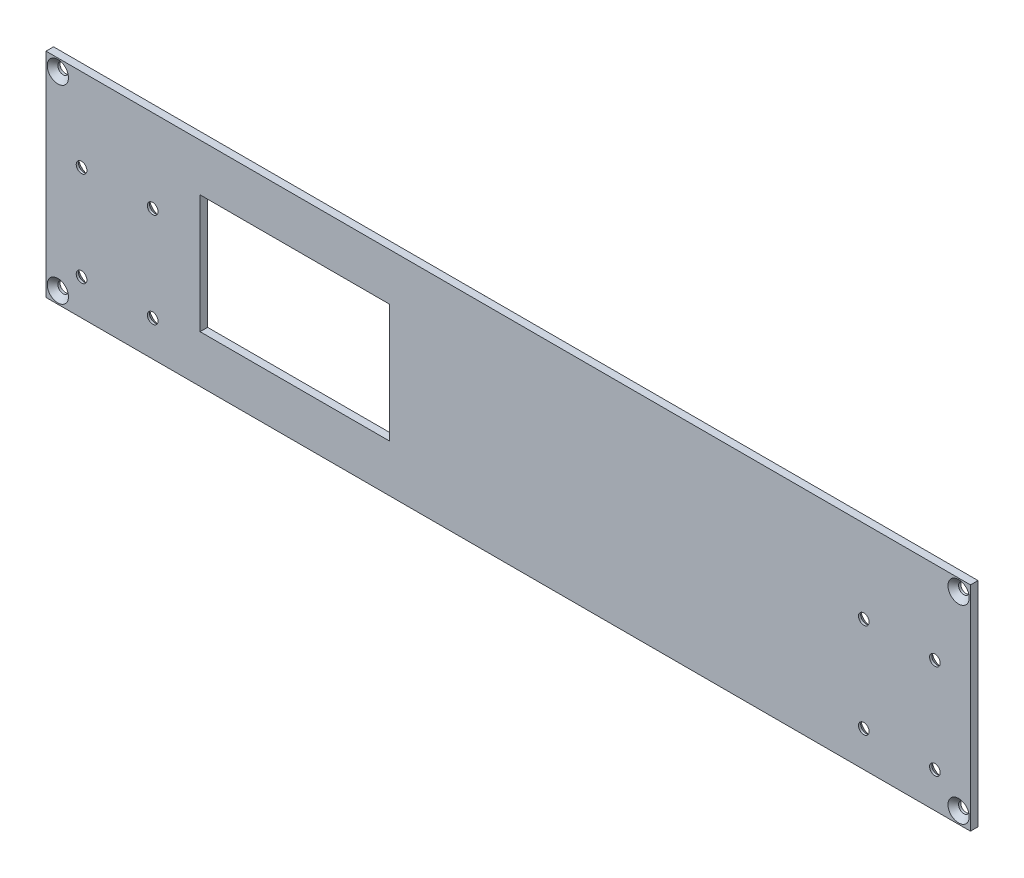
ISO-10303-21;
HEADER;
FILE_DESCRIPTION(('STEP AP214'),'2;1');
FILE_NAME('part.step','',(''),(''),'','','');
FILE_SCHEMA(('AUTOMOTIVE_DESIGN { 1 0 10303 214 1 1 1 1 }'));
ENDSEC;
DATA;
#1=APPLICATION_CONTEXT('core data for automotive mechanical design processes');
#2=APPLICATION_PROTOCOL_DEFINITION('international standard','automotive_design',2000,#1);
#3=PRODUCT_CONTEXT('',#1,'mechanical');
#4=PRODUCT('Part','Part','',(#3));
#5=PRODUCT_RELATED_PRODUCT_CATEGORY('part','',(#4));
#6=PRODUCT_DEFINITION_FORMATION('','',#4);
#7=PRODUCT_DEFINITION_CONTEXT('part definition',#1,'design');
#8=PRODUCT_DEFINITION('design','',#6,#7);
#9=PRODUCT_DEFINITION_SHAPE('','',#8);
#10=(LENGTH_UNIT() NAMED_UNIT(*) SI_UNIT(.MILLI.,.METRE.));
#11=(NAMED_UNIT(*) PLANE_ANGLE_UNIT() SI_UNIT($,.RADIAN.));
#12=(NAMED_UNIT(*) SI_UNIT($,.STERADIAN.) SOLID_ANGLE_UNIT());
#13=UNCERTAINTY_MEASURE_WITH_UNIT(LENGTH_MEASURE(1.E-05),#10,'distance_accuracy_value','');
#14=(GEOMETRIC_REPRESENTATION_CONTEXT(3) GLOBAL_UNCERTAINTY_ASSIGNED_CONTEXT((#13)) GLOBAL_UNIT_ASSIGNED_CONTEXT((#10,
#11,#12)) REPRESENTATION_CONTEXT('',''));
#15=CARTESIAN_POINT('',(0.,0.,0.));
#16=DIRECTION('',(0.,0.,1.));
#17=DIRECTION('',(1.,0.,0.));
#18=AXIS2_PLACEMENT_3D('',#15,#16,#17);
#19=CARTESIAN_POINT('',(195.,-45.,3.175));
#20=DIRECTION('',(-1.,0.,0.));
#21=DIRECTION('',(0.,0.,1.));
#22=AXIS2_PLACEMENT_3D('',#19,#20,#21);
#23=PLANE('',#22);
#24=DIRECTION('',(0.,1.,0.));
#25=VECTOR('',#24,1.);
#26=CARTESIAN_POINT('',(195.,-45.,0.));
#27=LINE('',#26,#25);
#28=CARTESIAN_POINT('',(195.,-45.,0.));
#29=VERTEX_POINT('',#28);
#30=CARTESIAN_POINT('',(195.,45.,0.));
#31=VERTEX_POINT('',#30);
#32=EDGE_CURVE('E296',#29,#31,#27,.T.);
#33=ORIENTED_EDGE('',*,*,#32,.T.);
#34=DIRECTION('',(0.,0.,-1.));
#35=VECTOR('',#34,1.);
#36=CARTESIAN_POINT('',(195.,45.,3.175));
#37=LINE('',#36,#35);
#38=CARTESIAN_POINT('',(195.,45.,3.175));
#39=VERTEX_POINT('',#38);
#40=EDGE_CURVE('E11',#39,#31,#37,.T.);
#41=ORIENTED_EDGE('',*,*,#40,.F.);
#42=DIRECTION('',(0.,1.,0.));
#43=VECTOR('',#42,1.);
#44=CARTESIAN_POINT('',(195.,-45.,3.175));
#45=LINE('',#44,#43);
#46=CARTESIAN_POINT('',(195.,-45.,3.175));
#47=VERTEX_POINT('',#46);
#48=EDGE_CURVE('E297',#47,#39,#45,.T.);
#49=ORIENTED_EDGE('',*,*,#48,.F.);
#50=DIRECTION('',(0.,0.,-1.));
#51=VECTOR('',#50,1.);
#52=CARTESIAN_POINT('',(195.,-45.,3.175));
#53=LINE('',#52,#51);
#54=EDGE_CURVE('E311',#47,#29,#53,.T.);
#55=ORIENTED_EDGE('',*,*,#54,.T.);
#56=EDGE_LOOP('',(#33,#41,#49,#55));
#57=FACE_BOUND('',#56,.T.);
#58=ADVANCED_FACE('F39',(#57),#23,.F.);
#59=CARTESIAN_POINT('',(-195.,45.,3.175));
#60=DIRECTION('',(0.,-1.,0.));
#61=DIRECTION('',(0.,0.,-1.));
#62=AXIS2_PLACEMENT_3D('',#59,#60,#61);
#63=PLANE('',#62);
#64=DIRECTION('',(-1.,0.,0.));
#65=VECTOR('',#64,1.);
#66=CARTESIAN_POINT('',(-195.,45.,0.));
#67=LINE('',#66,#65);
#68=CARTESIAN_POINT('',(-195.,45.,0.));
#69=VERTEX_POINT('',#68);
#70=EDGE_CURVE('E315',#31,#69,#67,.T.);
#71=ORIENTED_EDGE('',*,*,#70,.T.);
#72=DIRECTION('',(0.,0.,-1.));
#73=VECTOR('',#72,1.);
#74=CARTESIAN_POINT('',(-195.,45.,3.175));
#75=LINE('',#74,#73);
#76=CARTESIAN_POINT('',(-195.,45.,3.175));
#77=VERTEX_POINT('',#76);
#78=EDGE_CURVE('E47',#77,#69,#75,.T.);
#79=ORIENTED_EDGE('',*,*,#78,.F.);
#80=DIRECTION('',(-1.,0.,0.));
#81=VECTOR('',#80,1.);
#82=CARTESIAN_POINT('',(-195.,45.,3.175));
#83=LINE('',#82,#81);
#84=EDGE_CURVE('E301',#39,#77,#83,.T.);
#85=ORIENTED_EDGE('',*,*,#84,.F.);
#86=ORIENTED_EDGE('',*,*,#40,.T.);
#87=EDGE_LOOP('',(#71,#79,#85,#86));
#88=FACE_BOUND('',#87,.T.);
#89=ADVANCED_FACE('F350',(#88),#63,.F.);
#90=CARTESIAN_POINT('',(-195.,-45.,3.175));
#91=DIRECTION('',(1.,0.,0.));
#92=DIRECTION('',(0.,0.,-1.));
#93=AXIS2_PLACEMENT_3D('',#90,#91,#92);
#94=PLANE('',#93);
#95=DIRECTION('',(0.,-1.,0.));
#96=VECTOR('',#95,1.);
#97=CARTESIAN_POINT('',(-195.,-45.,0.));
#98=LINE('',#97,#96);
#99=CARTESIAN_POINT('',(-195.,-45.,0.));
#100=VERTEX_POINT('',#99);
#101=EDGE_CURVE('E318',#69,#100,#98,.T.);
#102=ORIENTED_EDGE('',*,*,#101,.T.);
#103=DIRECTION('',(0.,0.,-1.));
#104=VECTOR('',#103,1.);
#105=CARTESIAN_POINT('',(-195.,-45.,3.175));
#106=LINE('',#105,#104);
#107=CARTESIAN_POINT('',(-195.,-45.,3.175));
#108=VERTEX_POINT('',#107);
#109=EDGE_CURVE('E326',#108,#100,#106,.T.);
#110=ORIENTED_EDGE('',*,*,#109,.F.);
#111=DIRECTION('',(0.,-1.,0.));
#112=VECTOR('',#111,1.);
#113=CARTESIAN_POINT('',(-195.,-45.,3.175));
#114=LINE('',#113,#112);
#115=EDGE_CURVE('E305',#77,#108,#114,.T.);
#116=ORIENTED_EDGE('',*,*,#115,.F.);
#117=ORIENTED_EDGE('',*,*,#78,.T.);
#118=EDGE_LOOP('',(#102,#110,#116,#117));
#119=FACE_BOUND('',#118,.T.);
#120=ADVANCED_FACE('F335',(#119),#94,.F.);
#121=CARTESIAN_POINT('',(-195.,-45.,3.175));
#122=DIRECTION('',(0.,1.,0.));
#123=DIRECTION('',(0.,0.,1.));
#124=AXIS2_PLACEMENT_3D('',#121,#122,#123);
#125=PLANE('',#124);
#126=DIRECTION('',(1.,0.,0.));
#127=VECTOR('',#126,1.);
#128=CARTESIAN_POINT('',(-195.,-45.,0.));
#129=LINE('',#128,#127);
#130=EDGE_CURVE('E302',#100,#29,#129,.T.);
#131=ORIENTED_EDGE('',*,*,#130,.T.);
#132=ORIENTED_EDGE('',*,*,#54,.F.);
#133=DIRECTION('',(1.,0.,0.));
#134=VECTOR('',#133,1.);
#135=CARTESIAN_POINT('',(-195.,-45.,3.175));
#136=LINE('',#135,#134);
#137=EDGE_CURVE('E308',#108,#47,#136,.T.);
#138=ORIENTED_EDGE('',*,*,#137,.F.);
#139=ORIENTED_EDGE('',*,*,#109,.T.);
#140=EDGE_LOOP('',(#131,#132,#138,#139));
#141=FACE_BOUND('',#140,.T.);
#142=ADVANCED_FACE('F343',(#141),#125,.F.);
#143=CARTESIAN_POINT('',(0.,0.,3.175));
#144=DIRECTION('',(0.,0.,-1.));
#145=DIRECTION('',(-1.,0.,0.));
#146=AXIS2_PLACEMENT_3D('',#143,#144,#145);
#147=PLANE('',#146);
#148=DIRECTION('',(-1.,0.,0.));
#149=VECTOR('',#148,1.);
#150=CARTESIAN_POINT('',(-130.,25.,3.175));
#151=LINE('',#150,#149);
#152=CARTESIAN_POINT('',(-50.0000000000001,25.,3.175));
#153=VERTEX_POINT('',#152);
#154=CARTESIAN_POINT('',(-130.,25.,3.175));
#155=VERTEX_POINT('',#154);
#156=EDGE_CURVE('E138',#153,#155,#151,.T.);
#157=ORIENTED_EDGE('',*,*,#156,.F.);
#158=DIRECTION('',(0.,1.,0.));
#159=VECTOR('',#158,1.);
#160=CARTESIAN_POINT('',(-50.0000000000001,-25.,3.175));
#161=LINE('',#160,#159);
#162=CARTESIAN_POINT('',(-50.0000000000001,-25.,3.175));
#163=VERTEX_POINT('',#162);
#164=EDGE_CURVE('E54',#163,#153,#161,.T.);
#165=ORIENTED_EDGE('',*,*,#164,.F.);
#166=DIRECTION('',(1.,0.,0.));
#167=VECTOR('',#166,1.);
#168=CARTESIAN_POINT('',(-130.,-25.,3.175));
#169=LINE('',#168,#167);
#170=CARTESIAN_POINT('',(-130.,-25.,3.175));
#171=VERTEX_POINT('',#170);
#172=EDGE_CURVE('E125',#171,#163,#169,.T.);
#173=ORIENTED_EDGE('',*,*,#172,.F.);
#174=DIRECTION('',(0.,-1.,0.));
#175=VECTOR('',#174,1.);
#176=CARTESIAN_POINT('',(-130.,-25.,3.175));
#177=LINE('',#176,#175);
#178=EDGE_CURVE('E129',#155,#171,#177,.T.);
#179=ORIENTED_EDGE('',*,*,#178,.F.);
#180=EDGE_LOOP('',(#157,#165,#173,#179));
#181=FACE_BOUND('',#180,.T.);
#182=CARTESIAN_POINT('',(-190.,40.,3.175));
#183=DIRECTION('',(0.,0.,1.));
#184=DIRECTION('',(1.,0.,0.));
#185=AXIS2_PLACEMENT_3D('',#182,#183,#184);
#186=CIRCLE('',#185,4.48000000000001);
#187=CARTESIAN_POINT('',(-185.52,40.,3.175));
#188=VERTEX_POINT('',#187);
#189=EDGE_CURVE('E147',#188,#188,#186,.T.);
#190=ORIENTED_EDGE('',*,*,#189,.F.);
#191=EDGE_LOOP('',(#190));
#192=FACE_BOUND('',#191,.T.);
#193=CARTESIAN_POINT('',(-190.,-40.,3.175));
#194=DIRECTION('',(0.,0.,1.));
#195=DIRECTION('',(1.,0.,0.));
#196=AXIS2_PLACEMENT_3D('',#193,#194,#195);
#197=CIRCLE('',#196,4.48000000000001);
#198=CARTESIAN_POINT('',(-185.52,-40.,3.175));
#199=VERTEX_POINT('',#198);
#200=EDGE_CURVE('E164',#199,#199,#197,.T.);
#201=ORIENTED_EDGE('',*,*,#200,.F.);
#202=EDGE_LOOP('',(#201));
#203=FACE_BOUND('',#202,.T.);
#204=CARTESIAN_POINT('',(-150.,9.99999999999999,3.175));
#205=DIRECTION('',(0.,0.,-1.));
#206=DIRECTION('',(-1.,0.,0.));
#207=AXIS2_PLACEMENT_3D('',#204,#205,#206);
#208=CIRCLE('',#207,2.25);
#209=CARTESIAN_POINT('',(-152.25,9.99999999999999,3.175));
#210=VERTEX_POINT('',#209);
#211=EDGE_CURVE('E184',#210,#210,#208,.T.);
#212=ORIENTED_EDGE('',*,*,#211,.T.);
#213=EDGE_LOOP('',(#212));
#214=FACE_BOUND('',#213,.T.);
#215=CARTESIAN_POINT('',(-180.,-30.,3.175));
#216=DIRECTION('',(0.,0.,-1.));
#217=DIRECTION('',(-1.,0.,0.));
#218=AXIS2_PLACEMENT_3D('',#215,#216,#217);
#219=CIRCLE('',#218,2.25);
#220=CARTESIAN_POINT('',(-182.25,-30.,3.175));
#221=VERTEX_POINT('',#220);
#222=EDGE_CURVE('E196',#221,#221,#219,.T.);
#223=ORIENTED_EDGE('',*,*,#222,.T.);
#224=EDGE_LOOP('',(#223));
#225=FACE_BOUND('',#224,.T.);
#226=CARTESIAN_POINT('',(-180.,9.99999999999999,3.175));
#227=DIRECTION('',(0.,0.,-1.));
#228=DIRECTION('',(-1.,0.,0.));
#229=AXIS2_PLACEMENT_3D('',#226,#227,#228);
#230=CIRCLE('',#229,2.25);
#231=CARTESIAN_POINT('',(-182.25,9.99999999999999,3.175));
#232=VERTEX_POINT('',#231);
#233=EDGE_CURVE('E208',#232,#232,#230,.T.);
#234=ORIENTED_EDGE('',*,*,#233,.T.);
#235=EDGE_LOOP('',(#234));
#236=FACE_BOUND('',#235,.T.);
#237=CARTESIAN_POINT('',(-150.,-30.,3.175));
#238=DIRECTION('',(0.,0.,-1.));
#239=DIRECTION('',(-1.,0.,0.));
#240=AXIS2_PLACEMENT_3D('',#237,#238,#239);
#241=CIRCLE('',#240,2.25);
#242=CARTESIAN_POINT('',(-152.25,-30.,3.175));
#243=VERTEX_POINT('',#242);
#244=EDGE_CURVE('E220',#243,#243,#241,.T.);
#245=ORIENTED_EDGE('',*,*,#244,.T.);
#246=EDGE_LOOP('',(#245));
#247=FACE_BOUND('',#246,.T.);
#248=CARTESIAN_POINT('',(190.,40.,3.175));
#249=DIRECTION('',(0.,0.,1.));
#250=DIRECTION('',(1.,0.,0.));
#251=AXIS2_PLACEMENT_3D('',#248,#249,#250);
#252=CIRCLE('',#251,4.48000000000001);
#253=CARTESIAN_POINT('',(194.48,40.,3.175));
#254=VERTEX_POINT('',#253);
#255=EDGE_CURVE('E224',#254,#254,#252,.T.);
#256=ORIENTED_EDGE('',*,*,#255,.F.);
#257=EDGE_LOOP('',(#256));
#258=FACE_BOUND('',#257,.T.);
#259=CARTESIAN_POINT('',(190.,-40.,3.175));
#260=DIRECTION('',(0.,0.,1.));
#261=DIRECTION('',(1.,0.,0.));
#262=AXIS2_PLACEMENT_3D('',#259,#260,#261);
#263=CIRCLE('',#262,4.48000000000001);
#264=CARTESIAN_POINT('',(194.48,-40.,3.175));
#265=VERTEX_POINT('',#264);
#266=EDGE_CURVE('E236',#265,#265,#263,.T.);
#267=ORIENTED_EDGE('',*,*,#266,.F.);
#268=EDGE_LOOP('',(#267));
#269=FACE_BOUND('',#268,.T.);
#270=CARTESIAN_POINT('',(150.,9.99999999999999,3.175));
#271=DIRECTION('',(0.,0.,-1.));
#272=DIRECTION('',(-1.,0.,0.));
#273=AXIS2_PLACEMENT_3D('',#270,#271,#272);
#274=CIRCLE('',#273,2.25);
#275=CARTESIAN_POINT('',(147.75,9.99999999999999,3.175));
#276=VERTEX_POINT('',#275);
#277=EDGE_CURVE('E256',#276,#276,#274,.T.);
#278=ORIENTED_EDGE('',*,*,#277,.T.);
#279=EDGE_LOOP('',(#278));
#280=FACE_BOUND('',#279,.T.);
#281=CARTESIAN_POINT('',(180.,-30.,3.175));
#282=DIRECTION('',(0.,0.,-1.));
#283=DIRECTION('',(-1.,0.,0.));
#284=AXIS2_PLACEMENT_3D('',#281,#282,#283);
#285=CIRCLE('',#284,2.25);
#286=CARTESIAN_POINT('',(177.75,-30.,3.175));
#287=VERTEX_POINT('',#286);
#288=EDGE_CURVE('E268',#287,#287,#285,.T.);
#289=ORIENTED_EDGE('',*,*,#288,.T.);
#290=EDGE_LOOP('',(#289));
#291=FACE_BOUND('',#290,.T.);
#292=CARTESIAN_POINT('',(180.,9.99999999999999,3.175));
#293=DIRECTION('',(0.,0.,-1.));
#294=DIRECTION('',(-1.,0.,0.));
#295=AXIS2_PLACEMENT_3D('',#292,#293,#294);
#296=CIRCLE('',#295,2.25);
#297=CARTESIAN_POINT('',(177.75,9.99999999999999,3.175));
#298=VERTEX_POINT('',#297);
#299=EDGE_CURVE('E280',#298,#298,#296,.T.);
#300=ORIENTED_EDGE('',*,*,#299,.T.);
#301=EDGE_LOOP('',(#300));
#302=FACE_BOUND('',#301,.T.);
#303=CARTESIAN_POINT('',(150.,-30.,3.175));
#304=DIRECTION('',(0.,0.,-1.));
#305=DIRECTION('',(-1.,0.,0.));
#306=AXIS2_PLACEMENT_3D('',#303,#304,#305);
#307=CIRCLE('',#306,2.25);
#308=CARTESIAN_POINT('',(147.75,-30.,3.175));
#309=VERTEX_POINT('',#308);
#310=EDGE_CURVE('E292',#309,#309,#307,.T.);
#311=ORIENTED_EDGE('',*,*,#310,.T.);
#312=EDGE_LOOP('',(#311));
#313=FACE_BOUND('',#312,.T.);
#314=ORIENTED_EDGE('',*,*,#48,.T.);
#315=ORIENTED_EDGE('',*,*,#84,.T.);
#316=ORIENTED_EDGE('',*,*,#115,.T.);
#317=ORIENTED_EDGE('',*,*,#137,.T.);
#318=EDGE_LOOP('',(#314,#315,#316,#317));
#319=FACE_BOUND('',#318,.T.);
#320=ADVANCED_FACE('F349',(#181,#192,#203,#214,#225,#236,#247,#258,#269,#280,#291,#302,#313,
#319),#147,.F.);
#321=CARTESIAN_POINT('',(0.,0.,0.));
#322=DIRECTION('',(0.,0.,-1.));
#323=DIRECTION('',(-1.,0.,0.));
#324=AXIS2_PLACEMENT_3D('',#321,#322,#323);
#325=PLANE('',#324);
#326=DIRECTION('',(0.,1.,0.));
#327=VECTOR('',#326,1.);
#328=CARTESIAN_POINT('',(-50.0000000000001,-25.,0.));
#329=LINE('',#328,#327);
#330=CARTESIAN_POINT('',(-50.0000000000001,-25.,0.));
#331=VERTEX_POINT('',#330);
#332=CARTESIAN_POINT('',(-50.0000000000001,25.,0.));
#333=VERTEX_POINT('',#332);
#334=EDGE_CURVE('E106',#331,#333,#329,.T.);
#335=ORIENTED_EDGE('',*,*,#334,.T.);
#336=DIRECTION('',(-1.,0.,0.));
#337=VECTOR('',#336,1.);
#338=CARTESIAN_POINT('',(-130.,25.,0.));
#339=LINE('',#338,#337);
#340=CARTESIAN_POINT('',(-130.,25.,0.));
#341=VERTEX_POINT('',#340);
#342=EDGE_CURVE('E116',#333,#341,#339,.T.);
#343=ORIENTED_EDGE('',*,*,#342,.T.);
#344=DIRECTION('',(0.,-1.,0.));
#345=VECTOR('',#344,1.);
#346=CARTESIAN_POINT('',(-130.,-25.,0.));
#347=LINE('',#346,#345);
#348=CARTESIAN_POINT('',(-130.,-25.,0.));
#349=VERTEX_POINT('',#348);
#350=EDGE_CURVE('E62',#341,#349,#347,.T.);
#351=ORIENTED_EDGE('',*,*,#350,.T.);
#352=DIRECTION('',(1.,0.,0.));
#353=VECTOR('',#352,1.);
#354=CARTESIAN_POINT('',(-130.,-25.,0.));
#355=LINE('',#354,#353);
#356=EDGE_CURVE('E113',#349,#331,#355,.T.);
#357=ORIENTED_EDGE('',*,*,#356,.T.);
#358=EDGE_LOOP('',(#335,#343,#351,#357));
#359=FACE_BOUND('',#358,.T.);
#360=CARTESIAN_POINT('',(-190.,40.,0.));
#361=DIRECTION('',(0.,0.,1.));
#362=DIRECTION('',(1.,0.,0.));
#363=AXIS2_PLACEMENT_3D('',#360,#361,#362);
#364=CIRCLE('',#363,2.25);
#365=CARTESIAN_POINT('',(-187.75,40.,0.));
#366=VERTEX_POINT('',#365);
#367=EDGE_CURVE('E160',#366,#366,#364,.T.);
#368=ORIENTED_EDGE('',*,*,#367,.T.);
#369=EDGE_LOOP('',(#368));
#370=FACE_BOUND('',#369,.T.);
#371=CARTESIAN_POINT('',(-190.,-40.,0.));
#372=DIRECTION('',(0.,0.,1.));
#373=DIRECTION('',(1.,0.,0.));
#374=AXIS2_PLACEMENT_3D('',#371,#372,#373);
#375=CIRCLE('',#374,2.25);
#376=CARTESIAN_POINT('',(-187.75,-40.,0.));
#377=VERTEX_POINT('',#376);
#378=EDGE_CURVE('E172',#377,#377,#375,.T.);
#379=ORIENTED_EDGE('',*,*,#378,.T.);
#380=EDGE_LOOP('',(#379));
#381=FACE_BOUND('',#380,.T.);
#382=CARTESIAN_POINT('',(-150.,9.99999999999999,0.));
#383=DIRECTION('',(0.,0.,-1.));
#384=DIRECTION('',(-1.,0.,0.));
#385=AXIS2_PLACEMENT_3D('',#382,#383,#384);
#386=CIRCLE('',#385,4.48000000000001);
#387=CARTESIAN_POINT('',(-154.48,9.99999999999999,0.));
#388=VERTEX_POINT('',#387);
#389=EDGE_CURVE('E176',#388,#388,#386,.T.);
#390=ORIENTED_EDGE('',*,*,#389,.F.);
#391=EDGE_LOOP('',(#390));
#392=FACE_BOUND('',#391,.T.);
#393=CARTESIAN_POINT('',(-180.,-30.,0.));
#394=DIRECTION('',(0.,0.,-1.));
#395=DIRECTION('',(-1.,0.,0.));
#396=AXIS2_PLACEMENT_3D('',#393,#394,#395);
#397=CIRCLE('',#396,4.48000000000001);
#398=CARTESIAN_POINT('',(-184.48,-30.,0.));
#399=VERTEX_POINT('',#398);
#400=EDGE_CURVE('E188',#399,#399,#397,.T.);
#401=ORIENTED_EDGE('',*,*,#400,.F.);
#402=EDGE_LOOP('',(#401));
#403=FACE_BOUND('',#402,.T.);
#404=CARTESIAN_POINT('',(-180.,9.99999999999999,0.));
#405=DIRECTION('',(0.,0.,-1.));
#406=DIRECTION('',(-1.,0.,0.));
#407=AXIS2_PLACEMENT_3D('',#404,#405,#406);
#408=CIRCLE('',#407,4.48000000000001);
#409=CARTESIAN_POINT('',(-184.48,9.99999999999999,0.));
#410=VERTEX_POINT('',#409);
#411=EDGE_CURVE('E200',#410,#410,#408,.T.);
#412=ORIENTED_EDGE('',*,*,#411,.F.);
#413=EDGE_LOOP('',(#412));
#414=FACE_BOUND('',#413,.T.);
#415=CARTESIAN_POINT('',(-150.,-30.,0.));
#416=DIRECTION('',(0.,0.,-1.));
#417=DIRECTION('',(-1.,0.,0.));
#418=AXIS2_PLACEMENT_3D('',#415,#416,#417);
#419=CIRCLE('',#418,4.48000000000001);
#420=CARTESIAN_POINT('',(-154.48,-30.,0.));
#421=VERTEX_POINT('',#420);
#422=EDGE_CURVE('E212',#421,#421,#419,.T.);
#423=ORIENTED_EDGE('',*,*,#422,.F.);
#424=EDGE_LOOP('',(#423));
#425=FACE_BOUND('',#424,.T.);
#426=CARTESIAN_POINT('',(190.,40.,0.));
#427=DIRECTION('',(0.,0.,1.));
#428=DIRECTION('',(1.,0.,0.));
#429=AXIS2_PLACEMENT_3D('',#426,#427,#428);
#430=CIRCLE('',#429,2.25);
#431=CARTESIAN_POINT('',(192.25,40.,0.));
#432=VERTEX_POINT('',#431);
#433=EDGE_CURVE('E232',#432,#432,#430,.T.);
#434=ORIENTED_EDGE('',*,*,#433,.T.);
#435=EDGE_LOOP('',(#434));
#436=FACE_BOUND('',#435,.T.);
#437=CARTESIAN_POINT('',(190.,-40.,0.));
#438=DIRECTION('',(0.,0.,1.));
#439=DIRECTION('',(1.,0.,0.));
#440=AXIS2_PLACEMENT_3D('',#437,#438,#439);
#441=CIRCLE('',#440,2.25);
#442=CARTESIAN_POINT('',(192.25,-40.,0.));
#443=VERTEX_POINT('',#442);
#444=EDGE_CURVE('E244',#443,#443,#441,.T.);
#445=ORIENTED_EDGE('',*,*,#444,.T.);
#446=EDGE_LOOP('',(#445));
#447=FACE_BOUND('',#446,.T.);
#448=CARTESIAN_POINT('',(150.,9.99999999999999,0.));
#449=DIRECTION('',(0.,0.,-1.));
#450=DIRECTION('',(-1.,0.,0.));
#451=AXIS2_PLACEMENT_3D('',#448,#449,#450);
#452=CIRCLE('',#451,4.48000000000001);
#453=CARTESIAN_POINT('',(145.52,9.99999999999999,0.));
#454=VERTEX_POINT('',#453);
#455=EDGE_CURVE('E248',#454,#454,#452,.T.);
#456=ORIENTED_EDGE('',*,*,#455,.F.);
#457=EDGE_LOOP('',(#456));
#458=FACE_BOUND('',#457,.T.);
#459=CARTESIAN_POINT('',(180.,-30.,0.));
#460=DIRECTION('',(0.,0.,-1.));
#461=DIRECTION('',(-1.,0.,0.));
#462=AXIS2_PLACEMENT_3D('',#459,#460,#461);
#463=CIRCLE('',#462,4.48000000000001);
#464=CARTESIAN_POINT('',(175.52,-30.,0.));
#465=VERTEX_POINT('',#464);
#466=EDGE_CURVE('E260',#465,#465,#463,.T.);
#467=ORIENTED_EDGE('',*,*,#466,.F.);
#468=EDGE_LOOP('',(#467));
#469=FACE_BOUND('',#468,.T.);
#470=CARTESIAN_POINT('',(180.,9.99999999999999,0.));
#471=DIRECTION('',(0.,0.,-1.));
#472=DIRECTION('',(-1.,0.,0.));
#473=AXIS2_PLACEMENT_3D('',#470,#471,#472);
#474=CIRCLE('',#473,4.48000000000001);
#475=CARTESIAN_POINT('',(175.52,9.99999999999999,0.));
#476=VERTEX_POINT('',#475);
#477=EDGE_CURVE('E272',#476,#476,#474,.T.);
#478=ORIENTED_EDGE('',*,*,#477,.F.);
#479=EDGE_LOOP('',(#478));
#480=FACE_BOUND('',#479,.T.);
#481=CARTESIAN_POINT('',(150.,-30.,0.));
#482=DIRECTION('',(0.,0.,-1.));
#483=DIRECTION('',(-1.,0.,0.));
#484=AXIS2_PLACEMENT_3D('',#481,#482,#483);
#485=CIRCLE('',#484,4.48000000000001);
#486=CARTESIAN_POINT('',(145.52,-30.,0.));
#487=VERTEX_POINT('',#486);
#488=EDGE_CURVE('E284',#487,#487,#485,.T.);
#489=ORIENTED_EDGE('',*,*,#488,.F.);
#490=EDGE_LOOP('',(#489));
#491=FACE_BOUND('',#490,.T.);
#492=ORIENTED_EDGE('',*,*,#32,.F.);
#493=ORIENTED_EDGE('',*,*,#130,.F.);
#494=ORIENTED_EDGE('',*,*,#101,.F.);
#495=ORIENTED_EDGE('',*,*,#70,.F.);
#496=EDGE_LOOP('',(#492,#493,#494,#495));
#497=FACE_BOUND('',#496,.T.);
#498=ADVANCED_FACE('F121',(#359,#370,#381,#392,#403,#414,#425,#436,#447,#458,#469,#480,#491,
#497),#325,.T.);
#499=CARTESIAN_POINT('',(150.,-30.,0.));
#500=DIRECTION('',(0.,0.,-1.));
#501=DIRECTION('',(-1.,0.,0.));
#502=AXIS2_PLACEMENT_3D('',#499,#500,#501);
#503=CYLINDRICAL_SURFACE('',#502,2.25);
#504=ORIENTED_EDGE('',*,*,#310,.F.);
#505=EDGE_LOOP('',(#504));
#506=FACE_BOUND('',#505,.T.);
#507=CARTESIAN_POINT('',(150.,-30.,2.23));
#508=DIRECTION('',(0.,0.,-1.));
#509=DIRECTION('',(-1.,0.,0.));
#510=AXIS2_PLACEMENT_3D('',#507,#508,#509);
#511=CIRCLE('',#510,2.25);
#512=CARTESIAN_POINT('',(147.75,-30.,2.23));
#513=VERTEX_POINT('',#512);
#514=EDGE_CURVE('E288',#513,#513,#511,.T.);
#515=ORIENTED_EDGE('',*,*,#514,.T.);
#516=EDGE_LOOP('',(#515));
#517=FACE_BOUND('',#516,.T.);
#518=ADVANCED_FACE('F362',(#506,#517),#503,.F.);
#519=CARTESIAN_POINT('',(150.,-30.,0.));
#520=DIRECTION('',(0.,0.,-1.));
#521=DIRECTION('',(-1.,0.,0.));
#522=AXIS2_PLACEMENT_3D('',#519,#520,#521);
#523=CONICAL_SURFACE('',#522,4.48000000000001,0.785398163397451);
#524=ORIENTED_EDGE('',*,*,#514,.F.);
#525=EDGE_LOOP('',(#524));
#526=FACE_BOUND('',#525,.T.);
#527=ORIENTED_EDGE('',*,*,#488,.T.);
#528=EDGE_LOOP('',(#527));
#529=FACE_BOUND('',#528,.T.);
#530=ADVANCED_FACE('F368',(#526,#529),#523,.F.);
#531=CARTESIAN_POINT('',(180.,9.99999999999999,0.));
#532=DIRECTION('',(0.,0.,-1.));
#533=DIRECTION('',(-1.,0.,0.));
#534=AXIS2_PLACEMENT_3D('',#531,#532,#533);
#535=CYLINDRICAL_SURFACE('',#534,2.25);
#536=ORIENTED_EDGE('',*,*,#299,.F.);
#537=EDGE_LOOP('',(#536));
#538=FACE_BOUND('',#537,.T.);
#539=CARTESIAN_POINT('',(180.,9.99999999999999,2.23));
#540=DIRECTION('',(0.,0.,-1.));
#541=DIRECTION('',(-1.,0.,0.));
#542=AXIS2_PLACEMENT_3D('',#539,#540,#541);
#543=CIRCLE('',#542,2.25);
#544=CARTESIAN_POINT('',(177.75,9.99999999999999,2.23));
#545=VERTEX_POINT('',#544);
#546=EDGE_CURVE('E276',#545,#545,#543,.T.);
#547=ORIENTED_EDGE('',*,*,#546,.T.);
#548=EDGE_LOOP('',(#547));
#549=FACE_BOUND('',#548,.T.);
#550=ADVANCED_FACE('F372',(#538,#549),#535,.F.);
#551=CARTESIAN_POINT('',(180.,9.99999999999999,0.));
#552=DIRECTION('',(0.,0.,-1.));
#553=DIRECTION('',(-1.,0.,0.));
#554=AXIS2_PLACEMENT_3D('',#551,#552,#553);
#555=CONICAL_SURFACE('',#554,4.48000000000001,0.785398163397451);
#556=ORIENTED_EDGE('',*,*,#546,.F.);
#557=EDGE_LOOP('',(#556));
#558=FACE_BOUND('',#557,.T.);
#559=ORIENTED_EDGE('',*,*,#477,.T.);
#560=EDGE_LOOP('',(#559));
#561=FACE_BOUND('',#560,.T.);
#562=ADVANCED_FACE('F376',(#558,#561),#555,.F.);
#563=CARTESIAN_POINT('',(180.,-30.,0.));
#564=DIRECTION('',(0.,0.,-1.));
#565=DIRECTION('',(-1.,0.,0.));
#566=AXIS2_PLACEMENT_3D('',#563,#564,#565);
#567=CYLINDRICAL_SURFACE('',#566,2.25);
#568=ORIENTED_EDGE('',*,*,#288,.F.);
#569=EDGE_LOOP('',(#568));
#570=FACE_BOUND('',#569,.T.);
#571=CARTESIAN_POINT('',(180.,-30.,2.23));
#572=DIRECTION('',(0.,0.,-1.));
#573=DIRECTION('',(-1.,0.,0.));
#574=AXIS2_PLACEMENT_3D('',#571,#572,#573);
#575=CIRCLE('',#574,2.25);
#576=CARTESIAN_POINT('',(177.75,-30.,2.23));
#577=VERTEX_POINT('',#576);
#578=EDGE_CURVE('E264',#577,#577,#575,.T.);
#579=ORIENTED_EDGE('',*,*,#578,.T.);
#580=EDGE_LOOP('',(#579));
#581=FACE_BOUND('',#580,.T.);
#582=ADVANCED_FACE('F380',(#570,#581),#567,.F.);
#583=CARTESIAN_POINT('',(180.,-30.,0.));
#584=DIRECTION('',(0.,0.,-1.));
#585=DIRECTION('',(-1.,0.,0.));
#586=AXIS2_PLACEMENT_3D('',#583,#584,#585);
#587=CONICAL_SURFACE('',#586,4.48000000000001,0.785398163397451);
#588=ORIENTED_EDGE('',*,*,#578,.F.);
#589=EDGE_LOOP('',(#588));
#590=FACE_BOUND('',#589,.T.);
#591=ORIENTED_EDGE('',*,*,#466,.T.);
#592=EDGE_LOOP('',(#591));
#593=FACE_BOUND('',#592,.T.);
#594=ADVANCED_FACE('F384',(#590,#593),#587,.F.);
#595=CARTESIAN_POINT('',(150.,9.99999999999999,0.));
#596=DIRECTION('',(0.,0.,-1.));
#597=DIRECTION('',(-1.,0.,0.));
#598=AXIS2_PLACEMENT_3D('',#595,#596,#597);
#599=CYLINDRICAL_SURFACE('',#598,2.25);
#600=ORIENTED_EDGE('',*,*,#277,.F.);
#601=EDGE_LOOP('',(#600));
#602=FACE_BOUND('',#601,.T.);
#603=CARTESIAN_POINT('',(150.,9.99999999999999,2.23));
#604=DIRECTION('',(0.,0.,-1.));
#605=DIRECTION('',(-1.,0.,0.));
#606=AXIS2_PLACEMENT_3D('',#603,#604,#605);
#607=CIRCLE('',#606,2.25);
#608=CARTESIAN_POINT('',(147.75,9.99999999999999,2.23));
#609=VERTEX_POINT('',#608);
#610=EDGE_CURVE('E252',#609,#609,#607,.T.);
#611=ORIENTED_EDGE('',*,*,#610,.T.);
#612=EDGE_LOOP('',(#611));
#613=FACE_BOUND('',#612,.T.);
#614=ADVANCED_FACE('F388',(#602,#613),#599,.F.);
#615=CARTESIAN_POINT('',(150.,9.99999999999999,0.));
#616=DIRECTION('',(0.,0.,-1.));
#617=DIRECTION('',(-1.,0.,0.));
#618=AXIS2_PLACEMENT_3D('',#615,#616,#617);
#619=CONICAL_SURFACE('',#618,4.48000000000001,0.785398163397451);
#620=ORIENTED_EDGE('',*,*,#610,.F.);
#621=EDGE_LOOP('',(#620));
#622=FACE_BOUND('',#621,.T.);
#623=ORIENTED_EDGE('',*,*,#455,.T.);
#624=EDGE_LOOP('',(#623));
#625=FACE_BOUND('',#624,.T.);
#626=ADVANCED_FACE('F392',(#622,#625),#619,.F.);
#627=CARTESIAN_POINT('',(190.,-40.,3.175));
#628=DIRECTION('',(0.,0.,1.));
#629=DIRECTION('',(1.,0.,0.));
#630=AXIS2_PLACEMENT_3D('',#627,#628,#629);
#631=CYLINDRICAL_SURFACE('',#630,2.25);
#632=ORIENTED_EDGE('',*,*,#444,.F.);
#633=EDGE_LOOP('',(#632));
#634=FACE_BOUND('',#633,.T.);
#635=CARTESIAN_POINT('',(190.,-40.,0.94499999999999));
#636=DIRECTION('',(0.,0.,1.));
#637=DIRECTION('',(1.,0.,0.));
#638=AXIS2_PLACEMENT_3D('',#635,#636,#637);
#639=CIRCLE('',#638,2.25);
#640=CARTESIAN_POINT('',(192.25,-40.,0.94499999999999));
#641=VERTEX_POINT('',#640);
#642=EDGE_CURVE('E240',#641,#641,#639,.T.);
#643=ORIENTED_EDGE('',*,*,#642,.T.);
#644=EDGE_LOOP('',(#643));
#645=FACE_BOUND('',#644,.T.);
#646=ADVANCED_FACE('F396',(#634,#645),#631,.F.);
#647=CARTESIAN_POINT('',(190.,-40.,3.175));
#648=DIRECTION('',(0.,0.,1.));
#649=DIRECTION('',(1.,0.,0.));
#650=AXIS2_PLACEMENT_3D('',#647,#648,#649);
#651=CONICAL_SURFACE('',#650,4.48000000000001,0.785398163397448);
#652=ORIENTED_EDGE('',*,*,#642,.F.);
#653=EDGE_LOOP('',(#652));
#654=FACE_BOUND('',#653,.T.);
#655=ORIENTED_EDGE('',*,*,#266,.T.);
#656=EDGE_LOOP('',(#655));
#657=FACE_BOUND('',#656,.T.);
#658=ADVANCED_FACE('F400',(#654,#657),#651,.F.);
#659=CARTESIAN_POINT('',(190.,40.,3.175));
#660=DIRECTION('',(0.,0.,1.));
#661=DIRECTION('',(1.,0.,0.));
#662=AXIS2_PLACEMENT_3D('',#659,#660,#661);
#663=CYLINDRICAL_SURFACE('',#662,2.25);
#664=ORIENTED_EDGE('',*,*,#433,.F.);
#665=EDGE_LOOP('',(#664));
#666=FACE_BOUND('',#665,.T.);
#667=CARTESIAN_POINT('',(190.,40.,0.94499999999999));
#668=DIRECTION('',(0.,0.,1.));
#669=DIRECTION('',(1.,0.,0.));
#670=AXIS2_PLACEMENT_3D('',#667,#668,#669);
#671=CIRCLE('',#670,2.25);
#672=CARTESIAN_POINT('',(192.25,40.,0.94499999999999));
#673=VERTEX_POINT('',#672);
#674=EDGE_CURVE('E228',#673,#673,#671,.T.);
#675=ORIENTED_EDGE('',*,*,#674,.T.);
#676=EDGE_LOOP('',(#675));
#677=FACE_BOUND('',#676,.T.);
#678=ADVANCED_FACE('F404',(#666,#677),#663,.F.);
#679=CARTESIAN_POINT('',(190.,40.,3.175));
#680=DIRECTION('',(0.,0.,1.));
#681=DIRECTION('',(1.,0.,0.));
#682=AXIS2_PLACEMENT_3D('',#679,#680,#681);
#683=CONICAL_SURFACE('',#682,4.48000000000001,0.785398163397448);
#684=ORIENTED_EDGE('',*,*,#674,.F.);
#685=EDGE_LOOP('',(#684));
#686=FACE_BOUND('',#685,.T.);
#687=ORIENTED_EDGE('',*,*,#255,.T.);
#688=EDGE_LOOP('',(#687));
#689=FACE_BOUND('',#688,.T.);
#690=ADVANCED_FACE('F408',(#686,#689),#683,.F.);
#691=CARTESIAN_POINT('',(-150.,-30.,0.));
#692=DIRECTION('',(0.,0.,-1.));
#693=DIRECTION('',(-1.,0.,0.));
#694=AXIS2_PLACEMENT_3D('',#691,#692,#693);
#695=CYLINDRICAL_SURFACE('',#694,2.25);
#696=ORIENTED_EDGE('',*,*,#244,.F.);
#697=EDGE_LOOP('',(#696));
#698=FACE_BOUND('',#697,.T.);
#699=CARTESIAN_POINT('',(-150.,-30.,2.23));
#700=DIRECTION('',(0.,0.,-1.));
#701=DIRECTION('',(-1.,0.,0.));
#702=AXIS2_PLACEMENT_3D('',#699,#700,#701);
#703=CIRCLE('',#702,2.25);
#704=CARTESIAN_POINT('',(-152.25,-30.,2.23));
#705=VERTEX_POINT('',#704);
#706=EDGE_CURVE('E216',#705,#705,#703,.T.);
#707=ORIENTED_EDGE('',*,*,#706,.T.);
#708=EDGE_LOOP('',(#707));
#709=FACE_BOUND('',#708,.T.);
#710=ADVANCED_FACE('F412',(#698,#709),#695,.F.);
#711=CARTESIAN_POINT('',(-150.,-30.,0.));
#712=DIRECTION('',(0.,0.,-1.));
#713=DIRECTION('',(-1.,0.,0.));
#714=AXIS2_PLACEMENT_3D('',#711,#712,#713);
#715=CONICAL_SURFACE('',#714,4.48000000000001,0.785398163397451);
#716=ORIENTED_EDGE('',*,*,#706,.F.);
#717=EDGE_LOOP('',(#716));
#718=FACE_BOUND('',#717,.T.);
#719=ORIENTED_EDGE('',*,*,#422,.T.);
#720=EDGE_LOOP('',(#719));
#721=FACE_BOUND('',#720,.T.);
#722=ADVANCED_FACE('F416',(#718,#721),#715,.F.);
#723=CARTESIAN_POINT('',(-180.,9.99999999999999,0.));
#724=DIRECTION('',(0.,0.,-1.));
#725=DIRECTION('',(-1.,0.,0.));
#726=AXIS2_PLACEMENT_3D('',#723,#724,#725);
#727=CYLINDRICAL_SURFACE('',#726,2.25);
#728=ORIENTED_EDGE('',*,*,#233,.F.);
#729=EDGE_LOOP('',(#728));
#730=FACE_BOUND('',#729,.T.);
#731=CARTESIAN_POINT('',(-180.,9.99999999999999,2.23));
#732=DIRECTION('',(0.,0.,-1.));
#733=DIRECTION('',(-1.,0.,0.));
#734=AXIS2_PLACEMENT_3D('',#731,#732,#733);
#735=CIRCLE('',#734,2.25);
#736=CARTESIAN_POINT('',(-182.25,9.99999999999999,2.23));
#737=VERTEX_POINT('',#736);
#738=EDGE_CURVE('E204',#737,#737,#735,.T.);
#739=ORIENTED_EDGE('',*,*,#738,.T.);
#740=EDGE_LOOP('',(#739));
#741=FACE_BOUND('',#740,.T.);
#742=ADVANCED_FACE('F420',(#730,#741),#727,.F.);
#743=CARTESIAN_POINT('',(-180.,9.99999999999999,0.));
#744=DIRECTION('',(0.,0.,-1.));
#745=DIRECTION('',(-1.,0.,0.));
#746=AXIS2_PLACEMENT_3D('',#743,#744,#745);
#747=CONICAL_SURFACE('',#746,4.48000000000001,0.785398163397451);
#748=ORIENTED_EDGE('',*,*,#738,.F.);
#749=EDGE_LOOP('',(#748));
#750=FACE_BOUND('',#749,.T.);
#751=ORIENTED_EDGE('',*,*,#411,.T.);
#752=EDGE_LOOP('',(#751));
#753=FACE_BOUND('',#752,.T.);
#754=ADVANCED_FACE('F424',(#750,#753),#747,.F.);
#755=CARTESIAN_POINT('',(-180.,-30.,0.));
#756=DIRECTION('',(0.,0.,-1.));
#757=DIRECTION('',(-1.,0.,0.));
#758=AXIS2_PLACEMENT_3D('',#755,#756,#757);
#759=CYLINDRICAL_SURFACE('',#758,2.25);
#760=ORIENTED_EDGE('',*,*,#222,.F.);
#761=EDGE_LOOP('',(#760));
#762=FACE_BOUND('',#761,.T.);
#763=CARTESIAN_POINT('',(-180.,-30.,2.23));
#764=DIRECTION('',(0.,0.,-1.));
#765=DIRECTION('',(-1.,0.,0.));
#766=AXIS2_PLACEMENT_3D('',#763,#764,#765);
#767=CIRCLE('',#766,2.25);
#768=CARTESIAN_POINT('',(-182.25,-30.,2.23));
#769=VERTEX_POINT('',#768);
#770=EDGE_CURVE('E192',#769,#769,#767,.T.);
#771=ORIENTED_EDGE('',*,*,#770,.T.);
#772=EDGE_LOOP('',(#771));
#773=FACE_BOUND('',#772,.T.);
#774=ADVANCED_FACE('F428',(#762,#773),#759,.F.);
#775=CARTESIAN_POINT('',(-180.,-30.,0.));
#776=DIRECTION('',(0.,0.,-1.));
#777=DIRECTION('',(-1.,0.,0.));
#778=AXIS2_PLACEMENT_3D('',#775,#776,#777);
#779=CONICAL_SURFACE('',#778,4.48000000000001,0.785398163397451);
#780=ORIENTED_EDGE('',*,*,#770,.F.);
#781=EDGE_LOOP('',(#780));
#782=FACE_BOUND('',#781,.T.);
#783=ORIENTED_EDGE('',*,*,#400,.T.);
#784=EDGE_LOOP('',(#783));
#785=FACE_BOUND('',#784,.T.);
#786=ADVANCED_FACE('F432',(#782,#785),#779,.F.);
#787=CARTESIAN_POINT('',(-150.,9.99999999999999,0.));
#788=DIRECTION('',(0.,0.,-1.));
#789=DIRECTION('',(-1.,0.,0.));
#790=AXIS2_PLACEMENT_3D('',#787,#788,#789);
#791=CYLINDRICAL_SURFACE('',#790,2.25);
#792=ORIENTED_EDGE('',*,*,#211,.F.);
#793=EDGE_LOOP('',(#792));
#794=FACE_BOUND('',#793,.T.);
#795=CARTESIAN_POINT('',(-150.,9.99999999999999,2.23));
#796=DIRECTION('',(0.,0.,-1.));
#797=DIRECTION('',(-1.,0.,0.));
#798=AXIS2_PLACEMENT_3D('',#795,#796,#797);
#799=CIRCLE('',#798,2.25);
#800=CARTESIAN_POINT('',(-152.25,9.99999999999999,2.23));
#801=VERTEX_POINT('',#800);
#802=EDGE_CURVE('E180',#801,#801,#799,.T.);
#803=ORIENTED_EDGE('',*,*,#802,.T.);
#804=EDGE_LOOP('',(#803));
#805=FACE_BOUND('',#804,.T.);
#806=ADVANCED_FACE('F436',(#794,#805),#791,.F.);
#807=CARTESIAN_POINT('',(-150.,9.99999999999999,0.));
#808=DIRECTION('',(0.,0.,-1.));
#809=DIRECTION('',(-1.,0.,0.));
#810=AXIS2_PLACEMENT_3D('',#807,#808,#809);
#811=CONICAL_SURFACE('',#810,4.48000000000001,0.785398163397451);
#812=ORIENTED_EDGE('',*,*,#802,.F.);
#813=EDGE_LOOP('',(#812));
#814=FACE_BOUND('',#813,.T.);
#815=ORIENTED_EDGE('',*,*,#389,.T.);
#816=EDGE_LOOP('',(#815));
#817=FACE_BOUND('',#816,.T.);
#818=ADVANCED_FACE('F440',(#814,#817),#811,.F.);
#819=CARTESIAN_POINT('',(-190.,-40.,3.175));
#820=DIRECTION('',(0.,0.,1.));
#821=DIRECTION('',(1.,0.,0.));
#822=AXIS2_PLACEMENT_3D('',#819,#820,#821);
#823=CYLINDRICAL_SURFACE('',#822,2.25);
#824=ORIENTED_EDGE('',*,*,#378,.F.);
#825=EDGE_LOOP('',(#824));
#826=FACE_BOUND('',#825,.T.);
#827=CARTESIAN_POINT('',(-190.,-40.,0.94499999999999));
#828=DIRECTION('',(0.,0.,1.));
#829=DIRECTION('',(1.,0.,0.));
#830=AXIS2_PLACEMENT_3D('',#827,#828,#829);
#831=CIRCLE('',#830,2.25);
#832=CARTESIAN_POINT('',(-187.75,-40.,0.94499999999999));
#833=VERTEX_POINT('',#832);
#834=EDGE_CURVE('E168',#833,#833,#831,.T.);
#835=ORIENTED_EDGE('',*,*,#834,.T.);
#836=EDGE_LOOP('',(#835));
#837=FACE_BOUND('',#836,.T.);
#838=ADVANCED_FACE('F444',(#826,#837),#823,.F.);
#839=CARTESIAN_POINT('',(-190.,-40.,3.175));
#840=DIRECTION('',(0.,0.,1.));
#841=DIRECTION('',(1.,0.,0.));
#842=AXIS2_PLACEMENT_3D('',#839,#840,#841);
#843=CONICAL_SURFACE('',#842,4.48000000000001,0.785398163397448);
#844=ORIENTED_EDGE('',*,*,#834,.F.);
#845=EDGE_LOOP('',(#844));
#846=FACE_BOUND('',#845,.T.);
#847=ORIENTED_EDGE('',*,*,#200,.T.);
#848=EDGE_LOOP('',(#847));
#849=FACE_BOUND('',#848,.T.);
#850=ADVANCED_FACE('F448',(#846,#849),#843,.F.);
#851=CARTESIAN_POINT('',(-190.,40.,3.175));
#852=DIRECTION('',(0.,0.,1.));
#853=DIRECTION('',(1.,0.,0.));
#854=AXIS2_PLACEMENT_3D('',#851,#852,#853);
#855=CYLINDRICAL_SURFACE('',#854,2.25);
#856=ORIENTED_EDGE('',*,*,#367,.F.);
#857=EDGE_LOOP('',(#856));
#858=FACE_BOUND('',#857,.T.);
#859=CARTESIAN_POINT('',(-190.,40.,0.94499999999999));
#860=DIRECTION('',(0.,0.,1.));
#861=DIRECTION('',(1.,0.,0.));
#862=AXIS2_PLACEMENT_3D('',#859,#860,#861);
#863=CIRCLE('',#862,2.25);
#864=CARTESIAN_POINT('',(-187.75,40.,0.94499999999999));
#865=VERTEX_POINT('',#864);
#866=EDGE_CURVE('E156',#865,#865,#863,.T.);
#867=ORIENTED_EDGE('',*,*,#866,.T.);
#868=EDGE_LOOP('',(#867));
#869=FACE_BOUND('',#868,.T.);
#870=ADVANCED_FACE('F452',(#858,#869),#855,.F.);
#871=CARTESIAN_POINT('',(-190.,40.,3.175));
#872=DIRECTION('',(0.,0.,1.));
#873=DIRECTION('',(1.,0.,0.));
#874=AXIS2_PLACEMENT_3D('',#871,#872,#873);
#875=CONICAL_SURFACE('',#874,4.48000000000001,0.785398163397448);
#876=ORIENTED_EDGE('',*,*,#866,.F.);
#877=EDGE_LOOP('',(#876));
#878=FACE_BOUND('',#877,.T.);
#879=ORIENTED_EDGE('',*,*,#189,.T.);
#880=EDGE_LOOP('',(#879));
#881=FACE_BOUND('',#880,.T.);
#882=ADVANCED_FACE('F456',(#878,#881),#875,.F.);
#883=CARTESIAN_POINT('',(-50.0000000000001,-25.,0.));
#884=DIRECTION('',(1.,0.,0.));
#885=DIRECTION('',(0.,1.,0.));
#886=AXIS2_PLACEMENT_3D('',#883,#884,#885);
#887=PLANE('',#886);
#888=ORIENTED_EDGE('',*,*,#164,.T.);
#889=DIRECTION('',(0.,0.,1.));
#890=VECTOR('',#889,1.);
#891=CARTESIAN_POINT('',(-50.0000000000001,25.,0.));
#892=LINE('',#891,#890);
#893=EDGE_CURVE('E102',#333,#153,#892,.T.);
#894=ORIENTED_EDGE('',*,*,#893,.F.);
#895=ORIENTED_EDGE('',*,*,#334,.F.);
#896=DIRECTION('',(0.,0.,1.));
#897=VECTOR('',#896,1.);
#898=CARTESIAN_POINT('',(-50.0000000000001,-25.,0.));
#899=LINE('',#898,#897);
#900=EDGE_CURVE('E144',#331,#163,#899,.T.);
#901=ORIENTED_EDGE('',*,*,#900,.T.);
#902=EDGE_LOOP('',(#888,#894,#895,#901));
#903=FACE_BOUND('',#902,.T.);
#904=ADVANCED_FACE('F104',(#903),#887,.F.);
#905=CARTESIAN_POINT('',(-130.,-25.,0.));
#906=DIRECTION('',(0.,-1.,0.));
#907=DIRECTION('',(0.,0.,-1.));
#908=AXIS2_PLACEMENT_3D('',#905,#906,#907);
#909=PLANE('',#908);
#910=ORIENTED_EDGE('',*,*,#172,.T.);
#911=ORIENTED_EDGE('',*,*,#900,.F.);
#912=ORIENTED_EDGE('',*,*,#356,.F.);
#913=DIRECTION('',(0.,0.,1.));
#914=VECTOR('',#913,1.);
#915=CARTESIAN_POINT('',(-130.,-25.,0.));
#916=LINE('',#915,#914);
#917=EDGE_CURVE('E148',#349,#171,#916,.T.);
#918=ORIENTED_EDGE('',*,*,#917,.T.);
#919=EDGE_LOOP('',(#910,#911,#912,#918));
#920=FACE_BOUND('',#919,.T.);
#921=ADVANCED_FACE('F463',(#920),#909,.F.);
#922=CARTESIAN_POINT('',(-130.,-25.,0.));
#923=DIRECTION('',(-1.,0.,0.));
#924=DIRECTION('',(0.,0.,1.));
#925=AXIS2_PLACEMENT_3D('',#922,#923,#924);
#926=PLANE('',#925);
#927=ORIENTED_EDGE('',*,*,#178,.T.);
#928=ORIENTED_EDGE('',*,*,#917,.F.);
#929=ORIENTED_EDGE('',*,*,#350,.F.);
#930=DIRECTION('',(0.,0.,1.));
#931=VECTOR('',#930,1.);
#932=CARTESIAN_POINT('',(-130.,25.,0.));
#933=LINE('',#932,#931);
#934=EDGE_CURVE('E112',#341,#155,#933,.T.);
#935=ORIENTED_EDGE('',*,*,#934,.T.);
#936=EDGE_LOOP('',(#927,#928,#929,#935));
#937=FACE_BOUND('',#936,.T.);
#938=ADVANCED_FACE('F466',(#937),#926,.F.);
#939=CARTESIAN_POINT('',(-130.,25.,0.));
#940=DIRECTION('',(0.,1.,0.));
#941=DIRECTION('',(0.,0.,1.));
#942=AXIS2_PLACEMENT_3D('',#939,#940,#941);
#943=PLANE('',#942);
#944=ORIENTED_EDGE('',*,*,#156,.T.);
#945=ORIENTED_EDGE('',*,*,#934,.F.);
#946=ORIENTED_EDGE('',*,*,#342,.F.);
#947=ORIENTED_EDGE('',*,*,#893,.T.);
#948=EDGE_LOOP('',(#944,#945,#946,#947));
#949=FACE_BOUND('',#948,.T.);
#950=ADVANCED_FACE('F117',(#949),#943,.F.);
#951=CLOSED_SHELL('',(#58,#89,#120,#142,#320,#498,#518,#530,#550,#562,#582,#594,#614,#626,#646,
#658,#678,#690,#710,#722,#742,#754,#774,#786,#806,#818,#838,#850,#870,#882,#904,#921,#938,#950));
#952=MANIFOLD_SOLID_BREP('B2',#951);
#953=ADVANCED_BREP_SHAPE_REPRESENTATION('',(#18,#952),#14);
#954=SHAPE_DEFINITION_REPRESENTATION(#9,#953);
ENDSEC;
END-ISO-10303-21;
